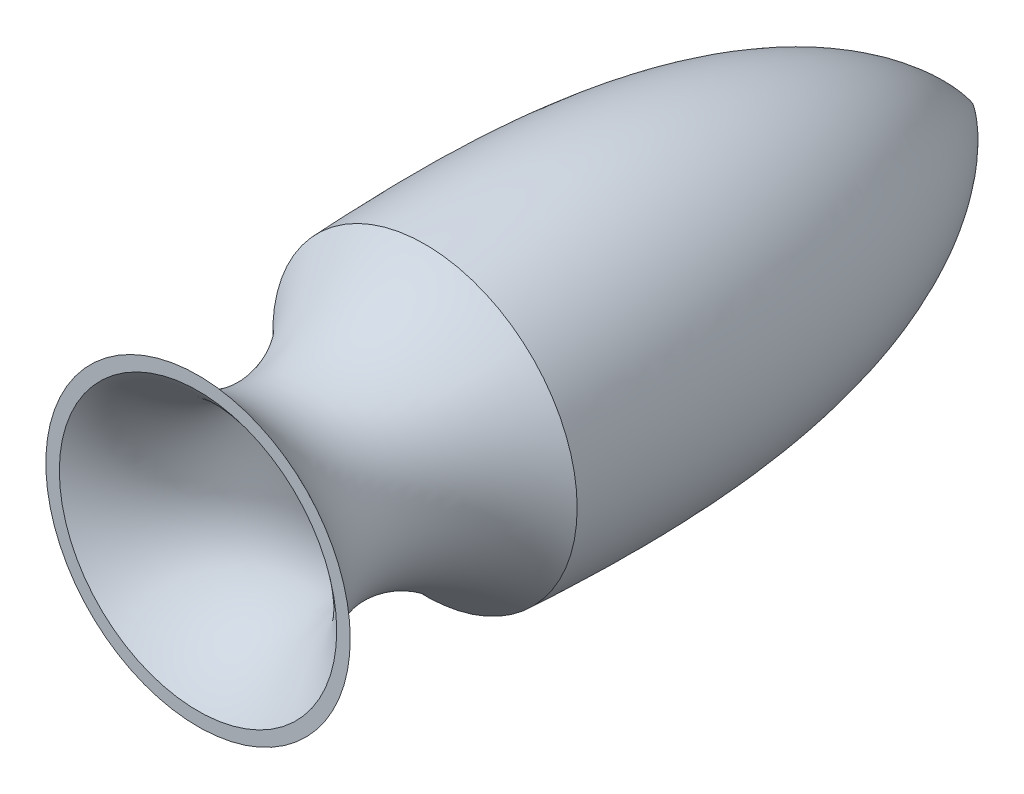
ISO-10303-21;
HEADER;
FILE_DESCRIPTION(('STEP AP214'),'2;1');
FILE_NAME('part.step','',(''),(''),'','','');
FILE_SCHEMA(('AUTOMOTIVE_DESIGN { 1 0 10303 214 1 1 1 1 }'));
ENDSEC;
DATA;
#1=APPLICATION_CONTEXT('core data for automotive mechanical design processes');
#2=APPLICATION_PROTOCOL_DEFINITION('international standard','automotive_design',2000,#1);
#3=PRODUCT_CONTEXT('',#1,'mechanical');
#4=PRODUCT('Part','Part','',(#3));
#5=PRODUCT_RELATED_PRODUCT_CATEGORY('part','',(#4));
#6=PRODUCT_DEFINITION_FORMATION('','',#4);
#7=PRODUCT_DEFINITION_CONTEXT('part definition',#1,'design');
#8=PRODUCT_DEFINITION('design','',#6,#7);
#9=PRODUCT_DEFINITION_SHAPE('','',#8);
#10=(LENGTH_UNIT() NAMED_UNIT(*) SI_UNIT(.MILLI.,.METRE.));
#11=(NAMED_UNIT(*) PLANE_ANGLE_UNIT() SI_UNIT($,.RADIAN.));
#12=(NAMED_UNIT(*) SI_UNIT($,.STERADIAN.) SOLID_ANGLE_UNIT());
#13=UNCERTAINTY_MEASURE_WITH_UNIT(LENGTH_MEASURE(1.E-05),#10,'distance_accuracy_value','');
#14=(GEOMETRIC_REPRESENTATION_CONTEXT(3) GLOBAL_UNCERTAINTY_ASSIGNED_CONTEXT((#13)) GLOBAL_UNIT_ASSIGNED_CONTEXT((#10,
#11,#12)) REPRESENTATION_CONTEXT('',''));
#15=CARTESIAN_POINT('',(0.,0.,0.));
#16=DIRECTION('',(0.,0.,1.));
#17=DIRECTION('',(1.,0.,0.));
#18=AXIS2_PLACEMENT_3D('',#15,#16,#17);
#19=CARTESIAN_POINT('',(982.337967225178,0.,-461.037347325799));
#20=CARTESIAN_POINT('',(1027.87343036084,0.,-1528.09266853609));
#21=CARTESIAN_POINT('',(1048.81638476965,0.,-3245.50590857566));
#22=CARTESIAN_POINT('',(0.,0.,-3996.49636521877));
#23=B_SPLINE_CURVE_WITH_KNOTS('',3,(#19,#20,#21,#22),.UNSPECIFIED.,.F.,.F.,(4,4),(0.,1.),.UNSPECIFIED.);
#24=CARTESIAN_POINT('',(0.,0.,1003.50363478123));
#25=DIRECTION('',(0.,0.,1.));
#26=AXIS1_PLACEMENT('',#24,#25);
#27=SURFACE_OF_REVOLUTION('',#23,#26);
#28=CARTESIAN_POINT('',(0.,0.,-3996.49636521877));
#29=VERTEX_POINT('',#28);
#30=VERTEX_LOOP('',#29);
#31=FACE_BOUND('',#30,.T.);
#32=CARTESIAN_POINT('',(0.,0.,-461.037347325799));
#33=DIRECTION('',(0.,0.,1.));
#34=DIRECTION('',(1.,0.,0.));
#35=AXIS2_PLACEMENT_3D('',#32,#33,#34);
#36=CIRCLE('',#35,982.337967225178);
#37=CARTESIAN_POINT('',(982.337967225178,0.,-461.037347325799));
#38=VERTEX_POINT('',#37);
#39=EDGE_CURVE('E43',#38,#38,#36,.T.);
#40=ORIENTED_EDGE('',*,*,#39,.F.);
#41=EDGE_LOOP('',(#40));
#42=FACE_BOUND('',#41,.T.);
#43=ADVANCED_FACE('F35',(#31,#42),#27,.F.);
#44=CARTESIAN_POINT('',(982.337967225178,0.,1003.50363478123));
#45=DIRECTION('',(0.,0.,1.));
#46=DIRECTION('',(1.,0.,0.));
#47=AXIS2_PLACEMENT_3D('',#44,#45,#46);
#48=PLANE('',#47);
#49=CARTESIAN_POINT('',(0.,0.,1003.50363478123));
#50=DIRECTION('',(0.,0.,1.));
#51=DIRECTION('',(1.,0.,0.));
#52=AXIS2_PLACEMENT_3D('',#49,#50,#51);
#53=CIRCLE('',#52,895.123477043975);
#54=CARTESIAN_POINT('',(895.123477043975,0.,1003.50363478123));
#55=VERTEX_POINT('',#54);
#56=EDGE_CURVE('E59',#55,#55,#53,.T.);
#57=ORIENTED_EDGE('',*,*,#56,.F.);
#58=EDGE_LOOP('',(#57));
#59=FACE_BOUND('',#58,.T.);
#60=CARTESIAN_POINT('',(0.,0.,1003.50363478123));
#61=DIRECTION('',(0.,0.,1.));
#62=DIRECTION('',(1.,0.,0.));
#63=AXIS2_PLACEMENT_3D('',#60,#61,#62);
#64=CIRCLE('',#63,982.337967225178);
#65=CARTESIAN_POINT('',(982.337967225178,0.,1003.50363478123));
#66=VERTEX_POINT('',#65);
#67=EDGE_CURVE('E11',#66,#66,#64,.T.);
#68=ORIENTED_EDGE('',*,*,#67,.T.);
#69=EDGE_LOOP('',(#68));
#70=FACE_BOUND('',#69,.T.);
#71=ADVANCED_FACE('F81',(#59,#70),#48,.T.);
#72=CARTESIAN_POINT('',(982.337967225178,0.,1003.50363478123));
#73=CARTESIAN_POINT('',(312.330763583024,0.,560.631833819351));
#74=CARTESIAN_POINT('',(582.665059353641,0.,-96.2830158814831));
#75=CARTESIAN_POINT('',(982.337967225178,0.,-461.037347325799));
#76=B_SPLINE_CURVE_WITH_KNOTS('',3,(#72,#73,#74,#75),.UNSPECIFIED.,.F.,.F.,(4,4),(0.,1.),.UNSPECIFIED.);
#77=CARTESIAN_POINT('',(0.,0.,1003.50363478123));
#78=DIRECTION('',(0.,0.,1.));
#79=AXIS1_PLACEMENT('',#77,#78);
#80=SURFACE_OF_REVOLUTION('',#76,#79);
#81=ORIENTED_EDGE('',*,*,#39,.T.);
#82=EDGE_LOOP('',(#81));
#83=FACE_BOUND('',#82,.T.);
#84=ORIENTED_EDGE('',*,*,#67,.F.);
#85=EDGE_LOOP('',(#84));
#86=FACE_BOUND('',#85,.T.);
#87=ADVANCED_FACE('F53',(#83,#86),#80,.F.);
#88=CARTESIAN_POINT('',(982.337967225178,0.,-461.037347325799));
#89=CARTESIAN_POINT('',(1027.43565217813,0.,-1517.83399305097));
#90=CARTESIAN_POINT('',(1048.41142035802,0.,-3212.54358067842));
#91=CARTESIAN_POINT('',(29.9542768412226,0.,-3974.56974652444));
#92=B_SPLINE_CURVE_WITH_KNOTS('',3,(#88,#89,#90,#91),.UNSPECIFIED.,.F.,.F.,(4,4),(0.,
0.99038599472661),.UNSPECIFIED.);
#93=CARTESIAN_POINT('',(0.,0.,1003.50363478123));
#94=DIRECTION('',(0.,0.,1.));
#95=AXIS1_PLACEMENT('',#93,#94);
#96=SURFACE_OF_REVOLUTION('',#92,#95);
#97=OFFSET_SURFACE('',#96,50.,.F.);
#98=CARTESIAN_POINT('',(-4.57966997657877E-13,0.,-3934.53549495258));
#99=VERTEX_POINT('',#98);
#100=VERTEX_LOOP('',#99);
#101=FACE_BOUND('',#100,.T.);
#102=CARTESIAN_POINT('',(0.,0.,-483.73661094066));
#103=DIRECTION('',(0.,0.,1.));
#104=DIRECTION('',(1.,0.,0.));
#105=AXIS2_PLACEMENT_3D('',#102,#103,#104);
#106=CIRCLE('',#105,933.254429070401);
#107=CARTESIAN_POINT('',(933.254429070401,0.,-483.73661094066));
#108=VERTEX_POINT('',#107);
#109=EDGE_CURVE('E57',#108,#108,#106,.T.);
#110=ORIENTED_EDGE('',*,*,#109,.T.);
#111=EDGE_LOOP('',(#110));
#112=FACE_BOUND('',#111,.T.);
#113=ADVANCED_FACE('F49',(#101,#112),#97,.T.);
#114=CARTESIAN_POINT('',(982.337967225178,0.,1003.50363478123));
#115=CARTESIAN_POINT('',(312.330763583024,0.,560.631833819351));
#116=CARTESIAN_POINT('',(582.665059353641,0.,-96.2830158814831));
#117=CARTESIAN_POINT('',(982.337967225178,0.,-461.037347325799));
#118=B_SPLINE_CURVE_WITH_KNOTS('',3,(#114,#115,#116,#117),.UNSPECIFIED.,.F.,.F.,(4,4),(0.,1.),.UNSPECIFIED.);
#119=CARTESIAN_POINT('',(0.,0.,1003.50363478123));
#120=DIRECTION('',(0.,0.,1.));
#121=AXIS1_PLACEMENT('',#119,#120);
#122=SURFACE_OF_REVOLUTION('',#118,#121);
#123=OFFSET_SURFACE('',#122,50.,.F.);
#124=ORIENTED_EDGE('',*,*,#109,.F.);
#125=EDGE_LOOP('',(#124));
#126=FACE_BOUND('',#125,.T.);
#127=ORIENTED_EDGE('',*,*,#56,.T.);
#128=EDGE_LOOP('',(#127));
#129=FACE_BOUND('',#128,.T.);
#130=ADVANCED_FACE('F52',(#126,#129),#123,.T.);
#131=CLOSED_SHELL('',(#43,#71,#87,#113,#130));
#132=MANIFOLD_SOLID_BREP('B2',#131);
#133=ADVANCED_BREP_SHAPE_REPRESENTATION('',(#18,#132),#14);
#134=SHAPE_DEFINITION_REPRESENTATION(#9,#133);
ENDSEC;
END-ISO-10303-21;
